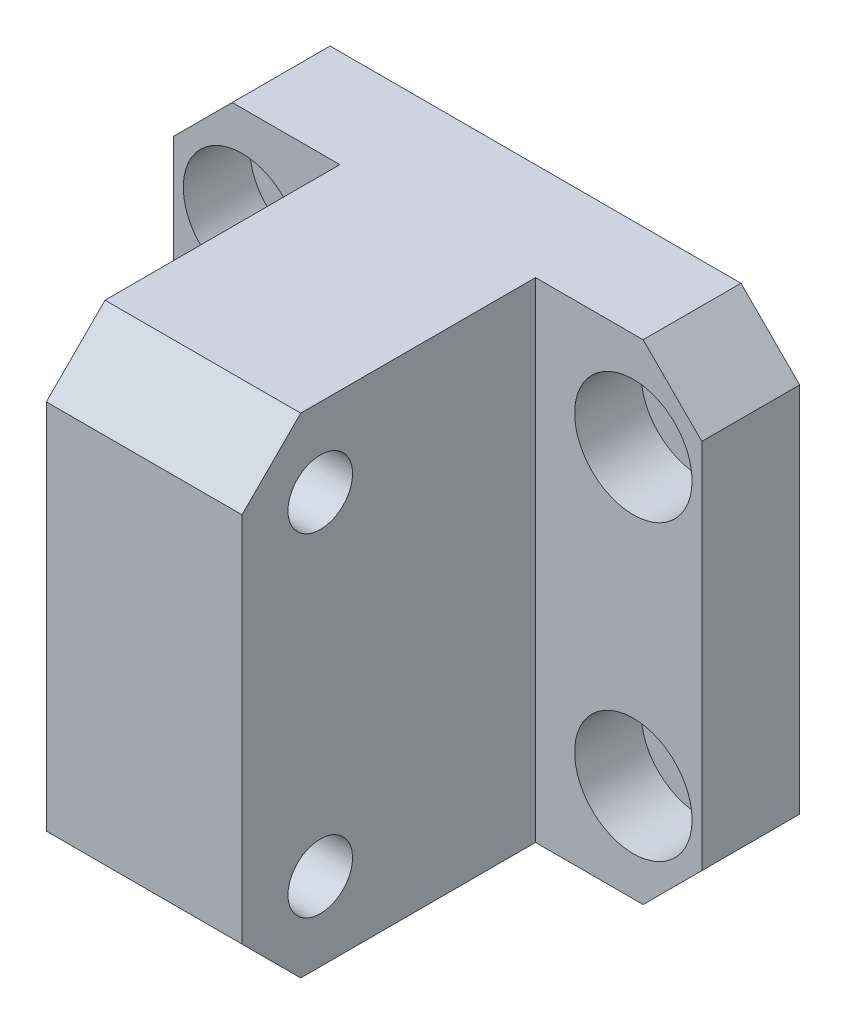
ISO-10303-21;
HEADER;
FILE_DESCRIPTION(('STEP AP214'),'2;1');
FILE_NAME('part.step','',(''),(''),'','','');
FILE_SCHEMA(('AUTOMOTIVE_DESIGN { 1 0 10303 214 1 1 1 1 }'));
ENDSEC;
DATA;
#1=APPLICATION_CONTEXT('core data for automotive mechanical design processes');
#2=APPLICATION_PROTOCOL_DEFINITION('international standard','automotive_design',2000,#1);
#3=PRODUCT_CONTEXT('',#1,'mechanical');
#4=PRODUCT('Part','Part','',(#3));
#5=PRODUCT_RELATED_PRODUCT_CATEGORY('part','',(#4));
#6=PRODUCT_DEFINITION_FORMATION('','',#4);
#7=PRODUCT_DEFINITION_CONTEXT('part definition',#1,'design');
#8=PRODUCT_DEFINITION('design','',#6,#7);
#9=PRODUCT_DEFINITION_SHAPE('','',#8);
#10=(LENGTH_UNIT() NAMED_UNIT(*) SI_UNIT(.MILLI.,.METRE.));
#11=(NAMED_UNIT(*) PLANE_ANGLE_UNIT() SI_UNIT($,.RADIAN.));
#12=(NAMED_UNIT(*) SI_UNIT($,.STERADIAN.) SOLID_ANGLE_UNIT());
#13=UNCERTAINTY_MEASURE_WITH_UNIT(LENGTH_MEASURE(1.E-05),#10,'distance_accuracy_value','');
#14=(GEOMETRIC_REPRESENTATION_CONTEXT(3) GLOBAL_UNCERTAINTY_ASSIGNED_CONTEXT((#13)) GLOBAL_UNIT_ASSIGNED_CONTEXT((#10,
#11,#12)) REPRESENTATION_CONTEXT('',''));
#15=CARTESIAN_POINT('',(0.,0.,0.));
#16=DIRECTION('',(0.,0.,1.));
#17=DIRECTION('',(1.,0.,0.));
#18=AXIS2_PLACEMENT_3D('',#15,#16,#17);
#19=CARTESIAN_POINT('',(0.,0.,5.));
#20=DIRECTION('',(0.,0.,-1.));
#21=DIRECTION('',(-1.,0.,0.));
#22=AXIS2_PLACEMENT_3D('',#19,#20,#21);
#23=PLANE('',#22);
#24=CARTESIAN_POINT('',(10.,7.5,5.));
#25=DIRECTION('',(0.,0.,1.));
#26=DIRECTION('',(1.,0.,0.));
#27=AXIS2_PLACEMENT_3D('',#24,#25,#26);
#28=CIRCLE('',#27,3.);
#29=CARTESIAN_POINT('',(13.,7.5,5.));
#30=VERTEX_POINT('',#29);
#31=EDGE_CURVE('E363',#30,#30,#28,.T.);
#32=ORIENTED_EDGE('',*,*,#31,.F.);
#33=EDGE_LOOP('',(#32));
#34=FACE_BOUND('',#33,.T.);
#35=CARTESIAN_POINT('',(10.,-7.5,5.));
#36=DIRECTION('',(0.,0.,1.));
#37=DIRECTION('',(1.,0.,0.));
#38=AXIS2_PLACEMENT_3D('',#35,#36,#37);
#39=CIRCLE('',#38,3.);
#40=CARTESIAN_POINT('',(13.,-7.5,5.));
#41=VERTEX_POINT('',#40);
#42=EDGE_CURVE('E347',#41,#41,#39,.T.);
#43=ORIENTED_EDGE('',*,*,#42,.F.);
#44=EDGE_LOOP('',(#43));
#45=FACE_BOUND('',#44,.T.);
#46=DIRECTION('',(0.,1.,0.));
#47=VECTOR('',#46,1.);
#48=CARTESIAN_POINT('',(13.5,-12.5,5.));
#49=LINE('',#48,#47);
#50=CARTESIAN_POINT('',(13.5,-9.5,5.));
#51=VERTEX_POINT('',#50);
#52=CARTESIAN_POINT('',(13.5,9.49999999999999,5.));
#53=VERTEX_POINT('',#52);
#54=EDGE_CURVE('E203',#51,#53,#49,.T.);
#55=ORIENTED_EDGE('',*,*,#54,.T.);
#56=DIRECTION('',(0.707106781186546,-0.707106781186549,0.));
#57=VECTOR('',#56,1.);
#58=CARTESIAN_POINT('',(10.5,12.5,5.));
#59=LINE('',#58,#57);
#60=CARTESIAN_POINT('',(10.5,12.5,5.));
#61=VERTEX_POINT('',#60);
#62=EDGE_CURVE('E287',#53,#61,#59,.F.);
#63=ORIENTED_EDGE('',*,*,#62,.T.);
#64=DIRECTION('',(-1.,0.,0.));
#65=VECTOR('',#64,1.);
#66=CARTESIAN_POINT('',(-13.5,12.5,5.));
#67=LINE('',#66,#65);
#68=CARTESIAN_POINT('',(5.,12.5,5.));
#69=VERTEX_POINT('',#68);
#70=EDGE_CURVE('E209',#61,#69,#67,.T.);
#71=ORIENTED_EDGE('',*,*,#70,.T.);
#72=DIRECTION('',(0.,1.,0.));
#73=VECTOR('',#72,1.);
#74=CARTESIAN_POINT('',(5.,-12.5,5.));
#75=LINE('',#74,#73);
#76=CARTESIAN_POINT('',(5.,-12.5,5.));
#77=VERTEX_POINT('',#76);
#78=EDGE_CURVE('E182',#77,#69,#75,.T.);
#79=ORIENTED_EDGE('',*,*,#78,.F.);
#80=DIRECTION('',(1.,0.,0.));
#81=VECTOR('',#80,1.);
#82=CARTESIAN_POINT('',(-13.5,-12.5,5.));
#83=LINE('',#82,#81);
#84=CARTESIAN_POINT('',(10.5,-12.5,5.));
#85=VERTEX_POINT('',#84);
#86=EDGE_CURVE('E163',#77,#85,#83,.T.);
#87=ORIENTED_EDGE('',*,*,#86,.T.);
#88=DIRECTION('',(-0.707106781186548,-0.707106781186547,0.));
#89=VECTOR('',#88,1.);
#90=CARTESIAN_POINT('',(13.5,-9.5,5.));
#91=LINE('',#90,#89);
#92=EDGE_CURVE('E284',#85,#51,#91,.F.);
#93=ORIENTED_EDGE('',*,*,#92,.T.);
#94=EDGE_LOOP('',(#55,#63,#71,#79,#87,#93));
#95=FACE_BOUND('',#94,.T.);
#96=ADVANCED_FACE('F49',(#34,#45,#95),#23,.F.);
#97=CARTESIAN_POINT('',(-10.,-7.5,5.));
#98=DIRECTION('',(0.,0.,1.));
#99=DIRECTION('',(1.,0.,0.));
#100=AXIS2_PLACEMENT_3D('',#97,#98,#99);
#101=CIRCLE('',#100,3.);
#102=CARTESIAN_POINT('',(-7.,-7.5,5.));
#103=VERTEX_POINT('',#102);
#104=EDGE_CURVE('E331',#103,#103,#101,.T.);
#105=ORIENTED_EDGE('',*,*,#104,.F.);
#106=EDGE_LOOP('',(#105));
#107=FACE_BOUND('',#106,.T.);
#108=CARTESIAN_POINT('',(-10.,7.5,5.));
#109=DIRECTION('',(0.,0.,1.));
#110=DIRECTION('',(1.,0.,0.));
#111=AXIS2_PLACEMENT_3D('',#108,#109,#110);
#112=CIRCLE('',#111,3.);
#113=CARTESIAN_POINT('',(-7.,7.5,5.));
#114=VERTEX_POINT('',#113);
#115=EDGE_CURVE('E315',#114,#114,#112,.T.);
#116=ORIENTED_EDGE('',*,*,#115,.F.);
#117=EDGE_LOOP('',(#116));
#118=FACE_BOUND('',#117,.T.);
#119=DIRECTION('',(0.,-1.,0.));
#120=VECTOR('',#119,1.);
#121=CARTESIAN_POINT('',(-13.5,-12.5,5.));
#122=LINE('',#121,#120);
#123=CARTESIAN_POINT('',(-13.5,9.5,5.));
#124=VERTEX_POINT('',#123);
#125=CARTESIAN_POINT('',(-13.5,-9.49999999999999,5.));
#126=VERTEX_POINT('',#125);
#127=EDGE_CURVE('E212',#124,#126,#122,.T.);
#128=ORIENTED_EDGE('',*,*,#127,.T.);
#129=DIRECTION('',(-0.707106781186547,0.707106781186548,0.));
#130=VECTOR('',#129,1.);
#131=CARTESIAN_POINT('',(-10.5,-12.5,5.));
#132=LINE('',#131,#130);
#133=CARTESIAN_POINT('',(-10.5,-12.5,5.));
#134=VERTEX_POINT('',#133);
#135=EDGE_CURVE('E11',#126,#134,#132,.F.);
#136=ORIENTED_EDGE('',*,*,#135,.T.);
#137=CARTESIAN_POINT('',(-5.,-12.5,5.));
#138=VERTEX_POINT('',#137);
#139=EDGE_CURVE('E151',#134,#138,#83,.T.);
#140=ORIENTED_EDGE('',*,*,#139,.T.);
#141=DIRECTION('',(0.,-1.,0.));
#142=VECTOR('',#141,1.);
#143=CARTESIAN_POINT('',(-5.,-12.5,5.));
#144=LINE('',#143,#142);
#145=CARTESIAN_POINT('',(-5.,12.5,5.));
#146=VERTEX_POINT('',#145);
#147=EDGE_CURVE('E155',#146,#138,#144,.T.);
#148=ORIENTED_EDGE('',*,*,#147,.F.);
#149=CARTESIAN_POINT('',(-10.5,12.5,5.));
#150=VERTEX_POINT('',#149);
#151=EDGE_CURVE('E207',#146,#150,#67,.T.);
#152=ORIENTED_EDGE('',*,*,#151,.T.);
#153=DIRECTION('',(0.707106781186548,0.707106781186547,0.));
#154=VECTOR('',#153,1.);
#155=CARTESIAN_POINT('',(-13.5,9.5,5.));
#156=LINE('',#155,#154);
#157=EDGE_CURVE('E59',#150,#124,#156,.F.);
#158=ORIENTED_EDGE('',*,*,#157,.T.);
#159=EDGE_LOOP('',(#128,#136,#140,#148,#152,#158));
#160=FACE_BOUND('',#159,.T.);
#161=ADVANCED_FACE('F153',(#107,#118,#160),#23,.F.);
#162=CARTESIAN_POINT('',(13.5,-12.5,5.));
#163=DIRECTION('',(-1.,0.,0.));
#164=DIRECTION('',(0.,-1.,0.));
#165=AXIS2_PLACEMENT_3D('',#162,#163,#164);
#166=PLANE('',#165);
#167=DIRECTION('',(0.,1.,0.));
#168=VECTOR('',#167,1.);
#169=CARTESIAN_POINT('',(13.5,-12.5,0.));
#170=LINE('',#169,#168);
#171=CARTESIAN_POINT('',(13.5,-9.5,0.));
#172=VERTEX_POINT('',#171);
#173=CARTESIAN_POINT('',(13.5,9.49999999999999,0.));
#174=VERTEX_POINT('',#173);
#175=EDGE_CURVE('E202',#172,#174,#170,.T.);
#176=ORIENTED_EDGE('',*,*,#175,.T.);
#177=DIRECTION('',(0.,0.,1.));
#178=VECTOR('',#177,1.);
#179=CARTESIAN_POINT('',(13.5,9.49999999999999,5.));
#180=LINE('',#179,#178);
#181=EDGE_CURVE('E281',#174,#53,#180,.T.);
#182=ORIENTED_EDGE('',*,*,#181,.T.);
#183=ORIENTED_EDGE('',*,*,#54,.F.);
#184=DIRECTION('',(0.,0.,-1.));
#185=VECTOR('',#184,1.);
#186=CARTESIAN_POINT('',(13.5,-9.5,5.));
#187=LINE('',#186,#185);
#188=EDGE_CURVE('E277',#51,#172,#187,.T.);
#189=ORIENTED_EDGE('',*,*,#188,.T.);
#190=EDGE_LOOP('',(#176,#182,#183,#189));
#191=FACE_BOUND('',#190,.T.);
#192=ADVANCED_FACE('F428',(#191),#166,.F.);
#193=CARTESIAN_POINT('',(-13.5,12.5,5.));
#194=DIRECTION('',(0.,-1.,0.));
#195=DIRECTION('',(0.,0.,-1.));
#196=AXIS2_PLACEMENT_3D('',#193,#194,#195);
#197=PLANE('',#196);
#198=DIRECTION('',(0.,0.,-1.));
#199=VECTOR('',#198,1.);
#200=CARTESIAN_POINT('',(-5.,12.5,20.));
#201=LINE('',#200,#199);
#202=CARTESIAN_POINT('',(-5.,12.5,17.));
#203=VERTEX_POINT('',#202);
#204=EDGE_CURVE('E174',#203,#146,#201,.T.);
#205=ORIENTED_EDGE('',*,*,#204,.F.);
#206=DIRECTION('',(1.,0.,0.));
#207=VECTOR('',#206,1.);
#208=CARTESIAN_POINT('',(-13.5,12.5,17.));
#209=LINE('',#208,#207);
#210=CARTESIAN_POINT('',(5.,12.5,17.));
#211=VERTEX_POINT('',#210);
#212=EDGE_CURVE('E248',#203,#211,#209,.T.);
#213=ORIENTED_EDGE('',*,*,#212,.T.);
#214=DIRECTION('',(0.,0.,-1.));
#215=VECTOR('',#214,1.);
#216=CARTESIAN_POINT('',(5.,12.5,20.));
#217=LINE('',#216,#215);
#218=EDGE_CURVE('E198',#211,#69,#217,.T.);
#219=ORIENTED_EDGE('',*,*,#218,.T.);
#220=ORIENTED_EDGE('',*,*,#70,.F.);
#221=DIRECTION('',(0.,0.,-1.));
#222=VECTOR('',#221,1.);
#223=CARTESIAN_POINT('',(10.5,12.5,5.));
#224=LINE('',#223,#222);
#225=CARTESIAN_POINT('',(10.5,12.5,0.));
#226=VERTEX_POINT('',#225);
#227=EDGE_CURVE('E244',#61,#226,#224,.T.);
#228=ORIENTED_EDGE('',*,*,#227,.T.);
#229=DIRECTION('',(-1.,0.,0.));
#230=VECTOR('',#229,1.);
#231=CARTESIAN_POINT('',(-13.5,12.5,0.));
#232=LINE('',#231,#230);
#233=CARTESIAN_POINT('',(-10.5,12.5,0.));
#234=VERTEX_POINT('',#233);
#235=EDGE_CURVE('E218',#226,#234,#232,.T.);
#236=ORIENTED_EDGE('',*,*,#235,.T.);
#237=DIRECTION('',(0.,0.,1.));
#238=VECTOR('',#237,1.);
#239=CARTESIAN_POINT('',(-10.5,12.5,5.));
#240=LINE('',#239,#238);
#241=EDGE_CURVE('E241',#234,#150,#240,.T.);
#242=ORIENTED_EDGE('',*,*,#241,.T.);
#243=ORIENTED_EDGE('',*,*,#151,.F.);
#244=EDGE_LOOP('',(#205,#213,#219,#220,#228,#236,#242,#243));
#245=FACE_BOUND('',#244,.T.);
#246=ADVANCED_FACE('F437',(#245),#197,.F.);
#247=CARTESIAN_POINT('',(-13.5,-12.5,5.));
#248=DIRECTION('',(1.,0.,0.));
#249=DIRECTION('',(0.,0.,-1.));
#250=AXIS2_PLACEMENT_3D('',#247,#248,#249);
#251=PLANE('',#250);
#252=DIRECTION('',(0.,-1.,0.));
#253=VECTOR('',#252,1.);
#254=CARTESIAN_POINT('',(-13.5,-12.5,0.));
#255=LINE('',#254,#253);
#256=CARTESIAN_POINT('',(-13.5,9.5,0.));
#257=VERTEX_POINT('',#256);
#258=CARTESIAN_POINT('',(-13.5,-9.49999999999999,0.));
#259=VERTEX_POINT('',#258);
#260=EDGE_CURVE('E222',#257,#259,#255,.T.);
#261=ORIENTED_EDGE('',*,*,#260,.T.);
#262=DIRECTION('',(0.,0.,1.));
#263=VECTOR('',#262,1.);
#264=CARTESIAN_POINT('',(-13.5,-9.49999999999999,5.));
#265=LINE('',#264,#263);
#266=EDGE_CURVE('E66',#259,#126,#265,.T.);
#267=ORIENTED_EDGE('',*,*,#266,.T.);
#268=ORIENTED_EDGE('',*,*,#127,.F.);
#269=DIRECTION('',(0.,0.,-1.));
#270=VECTOR('',#269,1.);
#271=CARTESIAN_POINT('',(-13.5,9.5,5.));
#272=LINE('',#271,#270);
#273=EDGE_CURVE('E290',#124,#257,#272,.T.);
#274=ORIENTED_EDGE('',*,*,#273,.T.);
#275=EDGE_LOOP('',(#261,#267,#268,#274));
#276=FACE_BOUND('',#275,.T.);
#277=ADVANCED_FACE('F442',(#276),#251,.F.);
#278=CARTESIAN_POINT('',(-13.5,-12.5,5.));
#279=DIRECTION('',(0.,1.,0.));
#280=DIRECTION('',(0.,0.,1.));
#281=AXIS2_PLACEMENT_3D('',#278,#279,#280);
#282=PLANE('',#281);
#283=DIRECTION('',(0.,0.,-1.));
#284=VECTOR('',#283,1.);
#285=CARTESIAN_POINT('',(5.,-12.5,20.));
#286=LINE('',#285,#284);
#287=CARTESIAN_POINT('',(5.,-12.5,17.));
#288=VERTEX_POINT('',#287);
#289=EDGE_CURVE('E175',#288,#77,#286,.T.);
#290=ORIENTED_EDGE('',*,*,#289,.F.);
#291=DIRECTION('',(-1.,0.,0.));
#292=VECTOR('',#291,1.);
#293=CARTESIAN_POINT('',(-13.5,-12.5,17.));
#294=LINE('',#293,#292);
#295=CARTESIAN_POINT('',(-5.,-12.5,17.));
#296=VERTEX_POINT('',#295);
#297=EDGE_CURVE('E170',#288,#296,#294,.T.);
#298=ORIENTED_EDGE('',*,*,#297,.T.);
#299=DIRECTION('',(0.,0.,-1.));
#300=VECTOR('',#299,1.);
#301=CARTESIAN_POINT('',(-5.,-12.5,20.));
#302=LINE('',#301,#300);
#303=EDGE_CURVE('E166',#296,#138,#302,.T.);
#304=ORIENTED_EDGE('',*,*,#303,.T.);
#305=ORIENTED_EDGE('',*,*,#139,.F.);
#306=DIRECTION('',(0.,0.,-1.));
#307=VECTOR('',#306,1.);
#308=CARTESIAN_POINT('',(-10.5,-12.5,5.));
#309=LINE('',#308,#307);
#310=CARTESIAN_POINT('',(-10.5,-12.5,0.));
#311=VERTEX_POINT('',#310);
#312=EDGE_CURVE('E257',#134,#311,#309,.T.);
#313=ORIENTED_EDGE('',*,*,#312,.T.);
#314=DIRECTION('',(1.,0.,0.));
#315=VECTOR('',#314,1.);
#316=CARTESIAN_POINT('',(-13.5,-12.5,0.));
#317=LINE('',#316,#315);
#318=CARTESIAN_POINT('',(10.5,-12.5,0.));
#319=VERTEX_POINT('',#318);
#320=EDGE_CURVE('E208',#311,#319,#317,.T.);
#321=ORIENTED_EDGE('',*,*,#320,.T.);
#322=DIRECTION('',(0.,0.,1.));
#323=VECTOR('',#322,1.);
#324=CARTESIAN_POINT('',(10.5,-12.5,5.));
#325=LINE('',#324,#323);
#326=EDGE_CURVE('E260',#319,#85,#325,.T.);
#327=ORIENTED_EDGE('',*,*,#326,.T.);
#328=ORIENTED_EDGE('',*,*,#86,.F.);
#329=EDGE_LOOP('',(#290,#298,#304,#305,#313,#321,#327,#328));
#330=FACE_BOUND('',#329,.T.);
#331=ADVANCED_FACE('F168',(#330),#282,.F.);
#332=CARTESIAN_POINT('',(0.,0.,0.));
#333=DIRECTION('',(0.,0.,-1.));
#334=DIRECTION('',(-1.,0.,0.));
#335=AXIS2_PLACEMENT_3D('',#332,#333,#334);
#336=PLANE('',#335);
#337=CARTESIAN_POINT('',(10.,7.5,0.));
#338=DIRECTION('',(0.,0.,1.));
#339=DIRECTION('',(1.,0.,0.));
#340=AXIS2_PLACEMENT_3D('',#337,#338,#339);
#341=CIRCLE('',#340,1.7);
#342=CARTESIAN_POINT('',(11.7,7.5,0.));
#343=VERTEX_POINT('',#342);
#344=EDGE_CURVE('E351',#343,#343,#341,.T.);
#345=ORIENTED_EDGE('',*,*,#344,.T.);
#346=EDGE_LOOP('',(#345));
#347=FACE_BOUND('',#346,.T.);
#348=CARTESIAN_POINT('',(10.,-7.5,0.));
#349=DIRECTION('',(0.,0.,1.));
#350=DIRECTION('',(1.,0.,0.));
#351=AXIS2_PLACEMENT_3D('',#348,#349,#350);
#352=CIRCLE('',#351,1.7);
#353=CARTESIAN_POINT('',(11.7,-7.5,0.));
#354=VERTEX_POINT('',#353);
#355=EDGE_CURVE('E335',#354,#354,#352,.T.);
#356=ORIENTED_EDGE('',*,*,#355,.T.);
#357=EDGE_LOOP('',(#356));
#358=FACE_BOUND('',#357,.T.);
#359=CARTESIAN_POINT('',(-10.,-7.5,0.));
#360=DIRECTION('',(0.,0.,1.));
#361=DIRECTION('',(1.,0.,0.));
#362=AXIS2_PLACEMENT_3D('',#359,#360,#361);
#363=CIRCLE('',#362,1.7);
#364=CARTESIAN_POINT('',(-8.3,-7.5,0.));
#365=VERTEX_POINT('',#364);
#366=EDGE_CURVE('E319',#365,#365,#363,.T.);
#367=ORIENTED_EDGE('',*,*,#366,.T.);
#368=EDGE_LOOP('',(#367));
#369=FACE_BOUND('',#368,.T.);
#370=CARTESIAN_POINT('',(-10.,7.5,0.));
#371=DIRECTION('',(0.,0.,1.));
#372=DIRECTION('',(1.,0.,0.));
#373=AXIS2_PLACEMENT_3D('',#370,#371,#372);
#374=CIRCLE('',#373,1.7);
#375=CARTESIAN_POINT('',(-8.3,7.5,0.));
#376=VERTEX_POINT('',#375);
#377=EDGE_CURVE('E190',#376,#376,#374,.T.);
#378=ORIENTED_EDGE('',*,*,#377,.T.);
#379=EDGE_LOOP('',(#378));
#380=FACE_BOUND('',#379,.T.);
#381=ORIENTED_EDGE('',*,*,#235,.F.);
#382=DIRECTION('',(-0.707106781186546,0.707106781186549,0.));
#383=VECTOR('',#382,1.);
#384=CARTESIAN_POINT('',(11.5,11.5,0.));
#385=LINE('',#384,#383);
#386=EDGE_CURVE('E274',#226,#174,#385,.F.);
#387=ORIENTED_EDGE('',*,*,#386,.T.);
#388=ORIENTED_EDGE('',*,*,#175,.F.);
#389=DIRECTION('',(0.707106781186548,0.707106781186547,0.));
#390=VECTOR('',#389,1.);
#391=CARTESIAN_POINT('',(11.5,-11.5,0.));
#392=LINE('',#391,#390);
#393=EDGE_CURVE('E271',#172,#319,#392,.F.);
#394=ORIENTED_EDGE('',*,*,#393,.T.);
#395=ORIENTED_EDGE('',*,*,#320,.F.);
#396=DIRECTION('',(0.707106781186547,-0.707106781186548,0.));
#397=VECTOR('',#396,1.);
#398=CARTESIAN_POINT('',(-11.5,-11.5,0.));
#399=LINE('',#398,#397);
#400=EDGE_CURVE('E268',#311,#259,#399,.F.);
#401=ORIENTED_EDGE('',*,*,#400,.T.);
#402=ORIENTED_EDGE('',*,*,#260,.F.);
#403=DIRECTION('',(-0.707106781186548,-0.707106781186547,0.));
#404=VECTOR('',#403,1.);
#405=CARTESIAN_POINT('',(-11.5,11.5,0.));
#406=LINE('',#405,#404);
#407=EDGE_CURVE('E265',#257,#234,#406,.F.);
#408=ORIENTED_EDGE('',*,*,#407,.T.);
#409=EDGE_LOOP('',(#381,#387,#388,#394,#395,#401,#402,#408));
#410=FACE_BOUND('',#409,.T.);
#411=ADVANCED_FACE('F403',(#347,#358,#369,#380,#410),#336,.T.);
#412=CARTESIAN_POINT('',(5.,-12.5,20.));
#413=DIRECTION('',(-1.,0.,0.));
#414=DIRECTION('',(0.,0.,1.));
#415=AXIS2_PLACEMENT_3D('',#412,#413,#414);
#416=PLANE('',#415);
#417=CARTESIAN_POINT('',(5.,8.50000000000001,16.));
#418=DIRECTION('',(-1.,0.,0.));
#419=DIRECTION('',(0.,0.,1.));
#420=AXIS2_PLACEMENT_3D('',#417,#418,#419);
#421=CIRCLE('',#420,1.65);
#422=CARTESIAN_POINT('',(5.,8.50000000000001,17.65));
#423=VERTEX_POINT('',#422);
#424=EDGE_CURVE('E375',#423,#423,#421,.T.);
#425=ORIENTED_EDGE('',*,*,#424,.T.);
#426=EDGE_LOOP('',(#425));
#427=FACE_BOUND('',#426,.T.);
#428=CARTESIAN_POINT('',(5.,-8.50000000000001,16.));
#429=DIRECTION('',(-1.,0.,0.));
#430=DIRECTION('',(0.,0.,1.));
#431=AXIS2_PLACEMENT_3D('',#428,#429,#430);
#432=CIRCLE('',#431,1.65);
#433=CARTESIAN_POINT('',(5.,-8.50000000000001,17.65));
#434=VERTEX_POINT('',#433);
#435=EDGE_CURVE('E367',#434,#434,#432,.T.);
#436=ORIENTED_EDGE('',*,*,#435,.T.);
#437=EDGE_LOOP('',(#436));
#438=FACE_BOUND('',#437,.T.);
#439=ORIENTED_EDGE('',*,*,#218,.F.);
#440=DIRECTION('',(0.,0.707106781186546,-0.707106781186549));
#441=VECTOR('',#440,1.);
#442=CARTESIAN_POINT('',(5.,9.5,20.));
#443=LINE('',#442,#441);
#444=CARTESIAN_POINT('',(5.,9.5,20.));
#445=VERTEX_POINT('',#444);
#446=EDGE_CURVE('E254',#211,#445,#443,.F.);
#447=ORIENTED_EDGE('',*,*,#446,.T.);
#448=DIRECTION('',(0.,1.,0.));
#449=VECTOR('',#448,1.);
#450=CARTESIAN_POINT('',(5.,-12.5,20.));
#451=LINE('',#450,#449);
#452=CARTESIAN_POINT('',(5.,-9.5,20.));
#453=VERTEX_POINT('',#452);
#454=EDGE_CURVE('E181',#453,#445,#451,.T.);
#455=ORIENTED_EDGE('',*,*,#454,.F.);
#456=DIRECTION('',(0.,0.707106781186547,0.707106781186548));
#457=VECTOR('',#456,1.);
#458=CARTESIAN_POINT('',(5.,-9.5,20.));
#459=LINE('',#458,#457);
#460=EDGE_CURVE('E251',#453,#288,#459,.F.);
#461=ORIENTED_EDGE('',*,*,#460,.T.);
#462=ORIENTED_EDGE('',*,*,#289,.T.);
#463=ORIENTED_EDGE('',*,*,#78,.T.);
#464=EDGE_LOOP('',(#439,#447,#455,#461,#462,#463));
#465=FACE_BOUND('',#464,.T.);
#466=ADVANCED_FACE('F390',(#427,#438,#465),#416,.F.);
#467=CARTESIAN_POINT('',(-5.,-12.5,20.));
#468=DIRECTION('',(1.,0.,0.));
#469=DIRECTION('',(0.,0.,-1.));
#470=AXIS2_PLACEMENT_3D('',#467,#468,#469);
#471=PLANE('',#470);
#472=CARTESIAN_POINT('',(-5.,8.50000000000001,16.));
#473=DIRECTION('',(-1.,0.,0.));
#474=DIRECTION('',(0.,0.,1.));
#475=AXIS2_PLACEMENT_3D('',#472,#473,#474);
#476=CIRCLE('',#475,1.65);
#477=CARTESIAN_POINT('',(-5.,8.50000000000001,17.65));
#478=VERTEX_POINT('',#477);
#479=EDGE_CURVE('E379',#478,#478,#476,.T.);
#480=ORIENTED_EDGE('',*,*,#479,.F.);
#481=EDGE_LOOP('',(#480));
#482=FACE_BOUND('',#481,.T.);
#483=CARTESIAN_POINT('',(-5.,-8.50000000000001,16.));
#484=DIRECTION('',(-1.,0.,0.));
#485=DIRECTION('',(0.,0.,1.));
#486=AXIS2_PLACEMENT_3D('',#483,#484,#485);
#487=CIRCLE('',#486,1.65);
#488=CARTESIAN_POINT('',(-5.,-8.50000000000001,17.65));
#489=VERTEX_POINT('',#488);
#490=EDGE_CURVE('E371',#489,#489,#487,.T.);
#491=ORIENTED_EDGE('',*,*,#490,.F.);
#492=EDGE_LOOP('',(#491));
#493=FACE_BOUND('',#492,.T.);
#494=DIRECTION('',(0.,-1.,0.));
#495=VECTOR('',#494,1.);
#496=CARTESIAN_POINT('',(-5.,-12.5,20.));
#497=LINE('',#496,#495);
#498=CARTESIAN_POINT('',(-5.,9.5,20.));
#499=VERTEX_POINT('',#498);
#500=CARTESIAN_POINT('',(-5.,-9.5,20.));
#501=VERTEX_POINT('',#500);
#502=EDGE_CURVE('E187',#499,#501,#497,.T.);
#503=ORIENTED_EDGE('',*,*,#502,.F.);
#504=DIRECTION('',(0.,-0.707106781186546,0.707106781186549));
#505=VECTOR('',#504,1.);
#506=CARTESIAN_POINT('',(-5.,9.5,20.));
#507=LINE('',#506,#505);
#508=EDGE_CURVE('E238',#499,#203,#507,.F.);
#509=ORIENTED_EDGE('',*,*,#508,.T.);
#510=ORIENTED_EDGE('',*,*,#204,.T.);
#511=ORIENTED_EDGE('',*,*,#147,.T.);
#512=ORIENTED_EDGE('',*,*,#303,.F.);
#513=DIRECTION('',(0.,-0.707106781186547,-0.707106781186548));
#514=VECTOR('',#513,1.);
#515=CARTESIAN_POINT('',(-5.,-9.5,20.));
#516=LINE('',#515,#514);
#517=EDGE_CURVE('E235',#296,#501,#516,.F.);
#518=ORIENTED_EDGE('',*,*,#517,.T.);
#519=EDGE_LOOP('',(#503,#509,#510,#511,#512,#518));
#520=FACE_BOUND('',#519,.T.);
#521=ADVANCED_FACE('F178',(#482,#493,#520),#471,.F.);
#522=CARTESIAN_POINT('',(0.,0.,20.));
#523=DIRECTION('',(0.,0.,-1.));
#524=DIRECTION('',(-1.,0.,0.));
#525=AXIS2_PLACEMENT_3D('',#522,#523,#524);
#526=PLANE('',#525);
#527=ORIENTED_EDGE('',*,*,#454,.T.);
#528=DIRECTION('',(-1.,0.,0.));
#529=VECTOR('',#528,1.);
#530=CARTESIAN_POINT('',(0.,9.5,20.));
#531=LINE('',#530,#529);
#532=EDGE_CURVE('E231',#445,#499,#531,.T.);
#533=ORIENTED_EDGE('',*,*,#532,.T.);
#534=ORIENTED_EDGE('',*,*,#502,.T.);
#535=DIRECTION('',(1.,0.,0.));
#536=VECTOR('',#535,1.);
#537=CARTESIAN_POINT('',(0.,-9.5,20.));
#538=LINE('',#537,#536);
#539=EDGE_CURVE('E162',#501,#453,#538,.T.);
#540=ORIENTED_EDGE('',*,*,#539,.T.);
#541=EDGE_LOOP('',(#527,#533,#534,#540));
#542=FACE_BOUND('',#541,.T.);
#543=ADVANCED_FACE('F389',(#542),#526,.F.);
#544=CARTESIAN_POINT('',(-10.,7.5,5.));
#545=DIRECTION('',(0.,0.,1.));
#546=DIRECTION('',(1.,0.,0.));
#547=AXIS2_PLACEMENT_3D('',#544,#545,#546);
#548=CYLINDRICAL_SURFACE('',#547,1.7);
#549=ORIENTED_EDGE('',*,*,#377,.F.);
#550=EDGE_LOOP('',(#549));
#551=FACE_BOUND('',#550,.T.);
#552=CARTESIAN_POINT('',(-10.,7.5,1.6));
#553=DIRECTION('',(0.,0.,1.));
#554=DIRECTION('',(1.,0.,0.));
#555=AXIS2_PLACEMENT_3D('',#552,#553,#554);
#556=CIRCLE('',#555,1.7);
#557=CARTESIAN_POINT('',(-8.3,7.5,1.6));
#558=VERTEX_POINT('',#557);
#559=EDGE_CURVE('E307',#558,#558,#556,.T.);
#560=ORIENTED_EDGE('',*,*,#559,.T.);
#561=EDGE_LOOP('',(#560));
#562=FACE_BOUND('',#561,.T.);
#563=ADVANCED_FACE('F656',(#551,#562),#548,.F.);
#564=CARTESIAN_POINT('',(-8.3,7.5,1.6));
#565=DIRECTION('',(0.,0.,-1.));
#566=DIRECTION('',(-1.,0.,0.));
#567=AXIS2_PLACEMENT_3D('',#564,#565,#566);
#568=PLANE('',#567);
#569=ORIENTED_EDGE('',*,*,#559,.F.);
#570=EDGE_LOOP('',(#569));
#571=FACE_BOUND('',#570,.T.);
#572=CARTESIAN_POINT('',(-10.,7.5,1.6));
#573=DIRECTION('',(0.,0.,1.));
#574=DIRECTION('',(1.,0.,0.));
#575=AXIS2_PLACEMENT_3D('',#572,#573,#574);
#576=CIRCLE('',#575,3.);
#577=CARTESIAN_POINT('',(-7.,7.5,1.6));
#578=VERTEX_POINT('',#577);
#579=EDGE_CURVE('E311',#578,#578,#576,.T.);
#580=ORIENTED_EDGE('',*,*,#579,.T.);
#581=EDGE_LOOP('',(#580));
#582=FACE_BOUND('',#581,.T.);
#583=ADVANCED_FACE('F646',(#571,#582),#568,.F.);
#584=CARTESIAN_POINT('',(-10.,7.5,5.));
#585=DIRECTION('',(0.,0.,1.));
#586=DIRECTION('',(1.,0.,0.));
#587=AXIS2_PLACEMENT_3D('',#584,#585,#586);
#588=CYLINDRICAL_SURFACE('',#587,3.);
#589=ORIENTED_EDGE('',*,*,#579,.F.);
#590=EDGE_LOOP('',(#589));
#591=FACE_BOUND('',#590,.T.);
#592=ORIENTED_EDGE('',*,*,#115,.T.);
#593=EDGE_LOOP('',(#592));
#594=FACE_BOUND('',#593,.T.);
#595=ADVANCED_FACE('F636',(#591,#594),#588,.F.);
#596=CARTESIAN_POINT('',(-10.,-7.5,5.));
#597=DIRECTION('',(0.,0.,1.));
#598=DIRECTION('',(1.,0.,0.));
#599=AXIS2_PLACEMENT_3D('',#596,#597,#598);
#600=CYLINDRICAL_SURFACE('',#599,1.7);
#601=ORIENTED_EDGE('',*,*,#366,.F.);
#602=EDGE_LOOP('',(#601));
#603=FACE_BOUND('',#602,.T.);
#604=CARTESIAN_POINT('',(-10.,-7.5,1.6));
#605=DIRECTION('',(0.,0.,1.));
#606=DIRECTION('',(1.,0.,0.));
#607=AXIS2_PLACEMENT_3D('',#604,#605,#606);
#608=CIRCLE('',#607,1.7);
#609=CARTESIAN_POINT('',(-8.3,-7.5,1.6));
#610=VERTEX_POINT('',#609);
#611=EDGE_CURVE('E323',#610,#610,#608,.T.);
#612=ORIENTED_EDGE('',*,*,#611,.T.);
#613=EDGE_LOOP('',(#612));
#614=FACE_BOUND('',#613,.T.);
#615=ADVANCED_FACE('F626',(#603,#614),#600,.F.);
#616=CARTESIAN_POINT('',(-8.3,-7.5,1.6));
#617=DIRECTION('',(0.,0.,-1.));
#618=DIRECTION('',(-1.,0.,0.));
#619=AXIS2_PLACEMENT_3D('',#616,#617,#618);
#620=PLANE('',#619);
#621=ORIENTED_EDGE('',*,*,#611,.F.);
#622=EDGE_LOOP('',(#621));
#623=FACE_BOUND('',#622,.T.);
#624=CARTESIAN_POINT('',(-10.,-7.5,1.6));
#625=DIRECTION('',(0.,0.,1.));
#626=DIRECTION('',(1.,0.,0.));
#627=AXIS2_PLACEMENT_3D('',#624,#625,#626);
#628=CIRCLE('',#627,3.);
#629=CARTESIAN_POINT('',(-7.,-7.5,1.6));
#630=VERTEX_POINT('',#629);
#631=EDGE_CURVE('E327',#630,#630,#628,.T.);
#632=ORIENTED_EDGE('',*,*,#631,.T.);
#633=EDGE_LOOP('',(#632));
#634=FACE_BOUND('',#633,.T.);
#635=ADVANCED_FACE('F616',(#623,#634),#620,.F.);
#636=CARTESIAN_POINT('',(-10.,-7.5,5.));
#637=DIRECTION('',(0.,0.,1.));
#638=DIRECTION('',(1.,0.,0.));
#639=AXIS2_PLACEMENT_3D('',#636,#637,#638);
#640=CYLINDRICAL_SURFACE('',#639,3.);
#641=ORIENTED_EDGE('',*,*,#631,.F.);
#642=EDGE_LOOP('',(#641));
#643=FACE_BOUND('',#642,.T.);
#644=ORIENTED_EDGE('',*,*,#104,.T.);
#645=EDGE_LOOP('',(#644));
#646=FACE_BOUND('',#645,.T.);
#647=ADVANCED_FACE('F606',(#643,#646),#640,.F.);
#648=CARTESIAN_POINT('',(10.,-7.5,5.));
#649=DIRECTION('',(0.,0.,1.));
#650=DIRECTION('',(1.,0.,0.));
#651=AXIS2_PLACEMENT_3D('',#648,#649,#650);
#652=CYLINDRICAL_SURFACE('',#651,1.7);
#653=ORIENTED_EDGE('',*,*,#355,.F.);
#654=EDGE_LOOP('',(#653));
#655=FACE_BOUND('',#654,.T.);
#656=CARTESIAN_POINT('',(10.,-7.5,1.6));
#657=DIRECTION('',(0.,0.,1.));
#658=DIRECTION('',(1.,0.,0.));
#659=AXIS2_PLACEMENT_3D('',#656,#657,#658);
#660=CIRCLE('',#659,1.7);
#661=CARTESIAN_POINT('',(11.7,-7.5,1.6));
#662=VERTEX_POINT('',#661);
#663=EDGE_CURVE('E339',#662,#662,#660,.T.);
#664=ORIENTED_EDGE('',*,*,#663,.T.);
#665=EDGE_LOOP('',(#664));
#666=FACE_BOUND('',#665,.T.);
#667=ADVANCED_FACE('F596',(#655,#666),#652,.F.);
#668=CARTESIAN_POINT('',(11.7,-7.5,1.6));
#669=DIRECTION('',(0.,0.,-1.));
#670=DIRECTION('',(-1.,0.,0.));
#671=AXIS2_PLACEMENT_3D('',#668,#669,#670);
#672=PLANE('',#671);
#673=ORIENTED_EDGE('',*,*,#663,.F.);
#674=EDGE_LOOP('',(#673));
#675=FACE_BOUND('',#674,.T.);
#676=CARTESIAN_POINT('',(10.,-7.5,1.6));
#677=DIRECTION('',(0.,0.,1.));
#678=DIRECTION('',(1.,0.,0.));
#679=AXIS2_PLACEMENT_3D('',#676,#677,#678);
#680=CIRCLE('',#679,3.);
#681=CARTESIAN_POINT('',(13.,-7.5,1.6));
#682=VERTEX_POINT('',#681);
#683=EDGE_CURVE('E343',#682,#682,#680,.T.);
#684=ORIENTED_EDGE('',*,*,#683,.T.);
#685=EDGE_LOOP('',(#684));
#686=FACE_BOUND('',#685,.T.);
#687=ADVANCED_FACE('F586',(#675,#686),#672,.F.);
#688=CARTESIAN_POINT('',(10.,-7.5,5.));
#689=DIRECTION('',(0.,0.,1.));
#690=DIRECTION('',(1.,0.,0.));
#691=AXIS2_PLACEMENT_3D('',#688,#689,#690);
#692=CYLINDRICAL_SURFACE('',#691,3.);
#693=ORIENTED_EDGE('',*,*,#683,.F.);
#694=EDGE_LOOP('',(#693));
#695=FACE_BOUND('',#694,.T.);
#696=ORIENTED_EDGE('',*,*,#42,.T.);
#697=EDGE_LOOP('',(#696));
#698=FACE_BOUND('',#697,.T.);
#699=ADVANCED_FACE('F576',(#695,#698),#692,.F.);
#700=CARTESIAN_POINT('',(10.,7.5,5.));
#701=DIRECTION('',(0.,0.,1.));
#702=DIRECTION('',(1.,0.,0.));
#703=AXIS2_PLACEMENT_3D('',#700,#701,#702);
#704=CYLINDRICAL_SURFACE('',#703,1.7);
#705=ORIENTED_EDGE('',*,*,#344,.F.);
#706=EDGE_LOOP('',(#705));
#707=FACE_BOUND('',#706,.T.);
#708=CARTESIAN_POINT('',(10.,7.5,1.6));
#709=DIRECTION('',(0.,0.,1.));
#710=DIRECTION('',(1.,0.,0.));
#711=AXIS2_PLACEMENT_3D('',#708,#709,#710);
#712=CIRCLE('',#711,1.7);
#713=CARTESIAN_POINT('',(11.7,7.5,1.6));
#714=VERTEX_POINT('',#713);
#715=EDGE_CURVE('E355',#714,#714,#712,.T.);
#716=ORIENTED_EDGE('',*,*,#715,.T.);
#717=EDGE_LOOP('',(#716));
#718=FACE_BOUND('',#717,.T.);
#719=ADVANCED_FACE('F566',(#707,#718),#704,.F.);
#720=CARTESIAN_POINT('',(11.7,7.5,1.6));
#721=DIRECTION('',(0.,0.,-1.));
#722=DIRECTION('',(-1.,0.,0.));
#723=AXIS2_PLACEMENT_3D('',#720,#721,#722);
#724=PLANE('',#723);
#725=ORIENTED_EDGE('',*,*,#715,.F.);
#726=EDGE_LOOP('',(#725));
#727=FACE_BOUND('',#726,.T.);
#728=CARTESIAN_POINT('',(10.,7.5,1.6));
#729=DIRECTION('',(0.,0.,1.));
#730=DIRECTION('',(1.,0.,0.));
#731=AXIS2_PLACEMENT_3D('',#728,#729,#730);
#732=CIRCLE('',#731,3.);
#733=CARTESIAN_POINT('',(13.,7.5,1.6));
#734=VERTEX_POINT('',#733);
#735=EDGE_CURVE('E359',#734,#734,#732,.T.);
#736=ORIENTED_EDGE('',*,*,#735,.T.);
#737=EDGE_LOOP('',(#736));
#738=FACE_BOUND('',#737,.T.);
#739=ADVANCED_FACE('F556',(#727,#738),#724,.F.);
#740=CARTESIAN_POINT('',(10.,7.5,5.));
#741=DIRECTION('',(0.,0.,1.));
#742=DIRECTION('',(1.,0.,0.));
#743=AXIS2_PLACEMENT_3D('',#740,#741,#742);
#744=CYLINDRICAL_SURFACE('',#743,3.);
#745=ORIENTED_EDGE('',*,*,#735,.F.);
#746=EDGE_LOOP('',(#745));
#747=FACE_BOUND('',#746,.T.);
#748=ORIENTED_EDGE('',*,*,#31,.T.);
#749=EDGE_LOOP('',(#748));
#750=FACE_BOUND('',#749,.T.);
#751=ADVANCED_FACE('F397',(#747,#750),#744,.F.);
#752=CARTESIAN_POINT('',(-5.,-8.50000000000001,16.));
#753=DIRECTION('',(-1.,0.,0.));
#754=DIRECTION('',(0.,0.,1.));
#755=AXIS2_PLACEMENT_3D('',#752,#753,#754);
#756=CYLINDRICAL_SURFACE('',#755,1.65);
#757=ORIENTED_EDGE('',*,*,#490,.T.);
#758=EDGE_LOOP('',(#757));
#759=FACE_BOUND('',#758,.T.);
#760=ORIENTED_EDGE('',*,*,#435,.F.);
#761=EDGE_LOOP('',(#760));
#762=FACE_BOUND('',#761,.T.);
#763=ADVANCED_FACE('F394',(#759,#762),#756,.F.);
#764=CARTESIAN_POINT('',(-5.,8.50000000000001,16.));
#765=DIRECTION('',(-1.,0.,0.));
#766=DIRECTION('',(0.,0.,1.));
#767=AXIS2_PLACEMENT_3D('',#764,#765,#766);
#768=CYLINDRICAL_SURFACE('',#767,1.65);
#769=ORIENTED_EDGE('',*,*,#479,.T.);
#770=EDGE_LOOP('',(#769));
#771=FACE_BOUND('',#770,.T.);
#772=ORIENTED_EDGE('',*,*,#424,.F.);
#773=EDGE_LOOP('',(#772));
#774=FACE_BOUND('',#773,.T.);
#775=ADVANCED_FACE('F384',(#771,#774),#768,.F.);
#776=CARTESIAN_POINT('',(0.,9.5,20.));
#777=DIRECTION('',(0.,-0.707106781186549,-0.707106781186546));
#778=DIRECTION('',(-1.,0.,0.));
#779=AXIS2_PLACEMENT_3D('',#776,#777,#778);
#780=PLANE('',#779);
#781=ORIENTED_EDGE('',*,*,#446,.F.);
#782=ORIENTED_EDGE('',*,*,#212,.F.);
#783=ORIENTED_EDGE('',*,*,#508,.F.);
#784=ORIENTED_EDGE('',*,*,#532,.F.);
#785=EDGE_LOOP('',(#781,#782,#783,#784));
#786=FACE_BOUND('',#785,.T.);
#787=ADVANCED_FACE('F415',(#786),#780,.F.);
#788=CARTESIAN_POINT('',(0.,-9.5,20.));
#789=DIRECTION('',(0.,0.707106781186548,-0.707106781186547));
#790=DIRECTION('',(1.,0.,0.));
#791=AXIS2_PLACEMENT_3D('',#788,#789,#790);
#792=PLANE('',#791);
#793=ORIENTED_EDGE('',*,*,#517,.F.);
#794=ORIENTED_EDGE('',*,*,#297,.F.);
#795=ORIENTED_EDGE('',*,*,#460,.F.);
#796=ORIENTED_EDGE('',*,*,#539,.F.);
#797=EDGE_LOOP('',(#793,#794,#795,#796));
#798=FACE_BOUND('',#797,.T.);
#799=ADVANCED_FACE('F417',(#798),#792,.F.);
#800=CARTESIAN_POINT('',(10.5,12.5,5.));
#801=DIRECTION('',(-0.707106781186549,-0.707106781186546,0.));
#802=DIRECTION('',(0.,0.,-1.));
#803=AXIS2_PLACEMENT_3D('',#800,#801,#802);
#804=PLANE('',#803);
#805=ORIENTED_EDGE('',*,*,#62,.F.);
#806=ORIENTED_EDGE('',*,*,#181,.F.);
#807=ORIENTED_EDGE('',*,*,#386,.F.);
#808=ORIENTED_EDGE('',*,*,#227,.F.);
#809=EDGE_LOOP('',(#805,#806,#807,#808));
#810=FACE_BOUND('',#809,.T.);
#811=ADVANCED_FACE('F436',(#810),#804,.F.);
#812=CARTESIAN_POINT('',(13.5,-9.5,5.));
#813=DIRECTION('',(-0.707106781186547,0.707106781186548,0.));
#814=DIRECTION('',(0.,0.,-1.));
#815=AXIS2_PLACEMENT_3D('',#812,#813,#814);
#816=PLANE('',#815);
#817=ORIENTED_EDGE('',*,*,#92,.F.);
#818=ORIENTED_EDGE('',*,*,#326,.F.);
#819=ORIENTED_EDGE('',*,*,#393,.F.);
#820=ORIENTED_EDGE('',*,*,#188,.F.);
#821=EDGE_LOOP('',(#817,#818,#819,#820));
#822=FACE_BOUND('',#821,.T.);
#823=ADVANCED_FACE('F425',(#822),#816,.F.);
#824=CARTESIAN_POINT('',(-10.5,-12.5,5.));
#825=DIRECTION('',(0.707106781186548,0.707106781186547,0.));
#826=DIRECTION('',(0.,0.,-1.));
#827=AXIS2_PLACEMENT_3D('',#824,#825,#826);
#828=PLANE('',#827);
#829=ORIENTED_EDGE('',*,*,#135,.F.);
#830=ORIENTED_EDGE('',*,*,#266,.F.);
#831=ORIENTED_EDGE('',*,*,#400,.F.);
#832=ORIENTED_EDGE('',*,*,#312,.F.);
#833=EDGE_LOOP('',(#829,#830,#831,#832));
#834=FACE_BOUND('',#833,.T.);
#835=ADVANCED_FACE('F444',(#834),#828,.F.);
#836=CARTESIAN_POINT('',(-13.5,9.5,5.));
#837=DIRECTION('',(0.707106781186547,-0.707106781186548,0.));
#838=DIRECTION('',(0.,0.,-1.));
#839=AXIS2_PLACEMENT_3D('',#836,#837,#838);
#840=PLANE('',#839);
#841=ORIENTED_EDGE('',*,*,#157,.F.);
#842=ORIENTED_EDGE('',*,*,#241,.F.);
#843=ORIENTED_EDGE('',*,*,#407,.F.);
#844=ORIENTED_EDGE('',*,*,#273,.F.);
#845=EDGE_LOOP('',(#841,#842,#843,#844));
#846=FACE_BOUND('',#845,.T.);
#847=ADVANCED_FACE('F52',(#846),#840,.F.);
#848=CLOSED_SHELL('',(#96,#161,#192,#246,#277,#331,#411,#466,#521,#543,#563,#583,#595,#615,#635,
#647,#667,#687,#699,#719,#739,#751,#763,#775,#787,#799,#811,#823,#835,#847));
#849=MANIFOLD_SOLID_BREP('B2',#848);
#850=ADVANCED_BREP_SHAPE_REPRESENTATION('',(#18,#849),#14);
#851=SHAPE_DEFINITION_REPRESENTATION(#9,#850);
ENDSEC;
END-ISO-10303-21;
